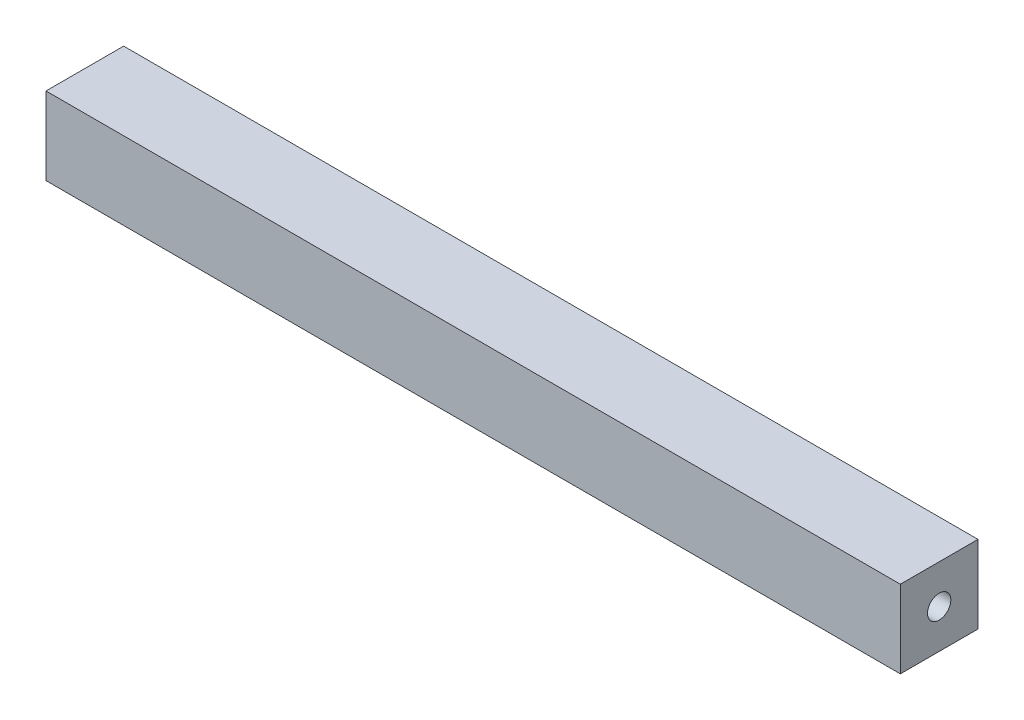
ISO-10303-21;
HEADER;
FILE_DESCRIPTION(('STEP AP214'),'2;1');
FILE_NAME('part.step','',(''),(''),'','','');
FILE_SCHEMA(('AUTOMOTIVE_DESIGN { 1 0 10303 214 1 1 1 1 }'));
ENDSEC;
DATA;
#1=APPLICATION_CONTEXT('core data for automotive mechanical design processes');
#2=APPLICATION_PROTOCOL_DEFINITION('international standard','automotive_design',2000,#1);
#3=PRODUCT_CONTEXT('',#1,'mechanical');
#4=PRODUCT('Part','Part','',(#3));
#5=PRODUCT_RELATED_PRODUCT_CATEGORY('part','',(#4));
#6=PRODUCT_DEFINITION_FORMATION('','',#4);
#7=PRODUCT_DEFINITION_CONTEXT('part definition',#1,'design');
#8=PRODUCT_DEFINITION('design','',#6,#7);
#9=PRODUCT_DEFINITION_SHAPE('','',#8);
#10=(LENGTH_UNIT() NAMED_UNIT(*) SI_UNIT(.MILLI.,.METRE.));
#11=(NAMED_UNIT(*) PLANE_ANGLE_UNIT() SI_UNIT($,.RADIAN.));
#12=(NAMED_UNIT(*) SI_UNIT($,.STERADIAN.) SOLID_ANGLE_UNIT());
#13=UNCERTAINTY_MEASURE_WITH_UNIT(LENGTH_MEASURE(1.E-05),#10,'distance_accuracy_value','');
#14=(GEOMETRIC_REPRESENTATION_CONTEXT(3) GLOBAL_UNCERTAINTY_ASSIGNED_CONTEXT((#13)) GLOBAL_UNIT_ASSIGNED_CONTEXT((#10,
#11,#12)) REPRESENTATION_CONTEXT('',''));
#15=CARTESIAN_POINT('',(0.,0.,0.));
#16=DIRECTION('',(0.,0.,1.));
#17=DIRECTION('',(1.,0.,0.));
#18=AXIS2_PLACEMENT_3D('',#15,#16,#17);
#19=CARTESIAN_POINT('',(55.,10.,5.));
#20=DIRECTION('',(-1.,0.,0.));
#21=DIRECTION('',(0.,0.,1.));
#22=AXIS2_PLACEMENT_3D('',#19,#20,#21);
#23=PLANE('',#22);
#24=CARTESIAN_POINT('',(55.,5.,0.));
#25=DIRECTION('',(1.,0.,0.));
#26=DIRECTION('',(0.,0.,-1.));
#27=AXIS2_PLACEMENT_3D('',#24,#25,#26);
#28=CIRCLE('',#27,1.5);
#29=CARTESIAN_POINT('',(55.,5.,-1.5));
#30=VERTEX_POINT('',#29);
#31=EDGE_CURVE('E112',#30,#30,#28,.T.);
#32=ORIENTED_EDGE('',*,*,#31,.F.);
#33=EDGE_LOOP('',(#32));
#34=FACE_BOUND('',#33,.T.);
#35=DIRECTION('',(0.,0.,-1.));
#36=VECTOR('',#35,1.);
#37=CARTESIAN_POINT('',(55.,0.,5.));
#38=LINE('',#37,#36);
#39=CARTESIAN_POINT('',(55.,0.,5.));
#40=VERTEX_POINT('',#39);
#41=CARTESIAN_POINT('',(55.,0.,-5.));
#42=VERTEX_POINT('',#41);
#43=EDGE_CURVE('E96',#40,#42,#38,.T.);
#44=ORIENTED_EDGE('',*,*,#43,.T.);
#45=DIRECTION('',(0.,-1.,0.));
#46=VECTOR('',#45,1.);
#47=CARTESIAN_POINT('',(55.,10.,-5.));
#48=LINE('',#47,#46);
#49=CARTESIAN_POINT('',(55.,10.,-5.));
#50=VERTEX_POINT('',#49);
#51=EDGE_CURVE('E11',#50,#42,#48,.T.);
#52=ORIENTED_EDGE('',*,*,#51,.F.);
#53=DIRECTION('',(0.,0.,-1.));
#54=VECTOR('',#53,1.);
#55=CARTESIAN_POINT('',(55.,10.,5.));
#56=LINE('',#55,#54);
#57=CARTESIAN_POINT('',(55.,10.,5.));
#58=VERTEX_POINT('',#57);
#59=EDGE_CURVE('E84',#58,#50,#56,.T.);
#60=ORIENTED_EDGE('',*,*,#59,.F.);
#61=DIRECTION('',(0.,-1.,0.));
#62=VECTOR('',#61,1.);
#63=CARTESIAN_POINT('',(55.,10.,5.));
#64=LINE('',#63,#62);
#65=EDGE_CURVE('E92',#58,#40,#64,.T.);
#66=ORIENTED_EDGE('',*,*,#65,.T.);
#67=EDGE_LOOP('',(#44,#52,#60,#66));
#68=FACE_BOUND('',#67,.T.);
#69=ADVANCED_FACE('F33',(#34,#68),#23,.F.);
#70=CARTESIAN_POINT('',(-55.,10.,-5.));
#71=DIRECTION('',(0.,0.,1.));
#72=DIRECTION('',(1.,0.,0.));
#73=AXIS2_PLACEMENT_3D('',#70,#71,#72);
#74=PLANE('',#73);
#75=DIRECTION('',(-1.,0.,0.));
#76=VECTOR('',#75,1.);
#77=CARTESIAN_POINT('',(-55.,0.,-5.));
#78=LINE('',#77,#76);
#79=CARTESIAN_POINT('',(-55.,0.,-5.));
#80=VERTEX_POINT('',#79);
#81=EDGE_CURVE('E88',#42,#80,#78,.T.);
#82=ORIENTED_EDGE('',*,*,#81,.T.);
#83=DIRECTION('',(0.,-1.,0.));
#84=VECTOR('',#83,1.);
#85=CARTESIAN_POINT('',(-55.,10.,-5.));
#86=LINE('',#85,#84);
#87=CARTESIAN_POINT('',(-55.,10.,-5.));
#88=VERTEX_POINT('',#87);
#89=EDGE_CURVE('E41',#88,#80,#86,.T.);
#90=ORIENTED_EDGE('',*,*,#89,.F.);
#91=DIRECTION('',(-1.,0.,0.));
#92=VECTOR('',#91,1.);
#93=CARTESIAN_POINT('',(-55.,10.,-5.));
#94=LINE('',#93,#92);
#95=EDGE_CURVE('E79',#50,#88,#94,.T.);
#96=ORIENTED_EDGE('',*,*,#95,.F.);
#97=ORIENTED_EDGE('',*,*,#51,.T.);
#98=EDGE_LOOP('',(#82,#90,#96,#97));
#99=FACE_BOUND('',#98,.T.);
#100=ADVANCED_FACE('F87',(#99),#74,.F.);
#101=CARTESIAN_POINT('',(-55.,10.,5.));
#102=DIRECTION('',(1.,0.,0.));
#103=DIRECTION('',(0.,0.,-1.));
#104=AXIS2_PLACEMENT_3D('',#101,#102,#103);
#105=PLANE('',#104);
#106=CARTESIAN_POINT('',(-55.,5.,0.));
#107=DIRECTION('',(1.,0.,0.));
#108=DIRECTION('',(0.,0.,-1.));
#109=AXIS2_PLACEMENT_3D('',#106,#107,#108);
#110=CIRCLE('',#109,1.5);
#111=CARTESIAN_POINT('',(-55.,5.,-1.5));
#112=VERTEX_POINT('',#111);
#113=EDGE_CURVE('E99',#112,#112,#110,.T.);
#114=ORIENTED_EDGE('',*,*,#113,.T.);
#115=EDGE_LOOP('',(#114));
#116=FACE_BOUND('',#115,.T.);
#117=DIRECTION('',(0.,0.,1.));
#118=VECTOR('',#117,1.);
#119=CARTESIAN_POINT('',(-55.,0.,5.));
#120=LINE('',#119,#118);
#121=CARTESIAN_POINT('',(-55.,0.,5.));
#122=VERTEX_POINT('',#121);
#123=EDGE_CURVE('E66',#80,#122,#120,.T.);
#124=ORIENTED_EDGE('',*,*,#123,.T.);
#125=DIRECTION('',(0.,-1.,0.));
#126=VECTOR('',#125,1.);
#127=CARTESIAN_POINT('',(-55.,10.,5.));
#128=LINE('',#127,#126);
#129=CARTESIAN_POINT('',(-55.,10.,5.));
#130=VERTEX_POINT('',#129);
#131=EDGE_CURVE('E89',#130,#122,#128,.T.);
#132=ORIENTED_EDGE('',*,*,#131,.F.);
#133=DIRECTION('',(0.,0.,1.));
#134=VECTOR('',#133,1.);
#135=CARTESIAN_POINT('',(-55.,10.,5.));
#136=LINE('',#135,#134);
#137=EDGE_CURVE('E82',#88,#130,#136,.T.);
#138=ORIENTED_EDGE('',*,*,#137,.F.);
#139=ORIENTED_EDGE('',*,*,#89,.T.);
#140=EDGE_LOOP('',(#124,#132,#138,#139));
#141=FACE_BOUND('',#140,.T.);
#142=ADVANCED_FACE('F90',(#116,#141),#105,.F.);
#143=CARTESIAN_POINT('',(-55.,10.,5.));
#144=DIRECTION('',(0.,0.,-1.));
#145=DIRECTION('',(-1.,0.,0.));
#146=AXIS2_PLACEMENT_3D('',#143,#144,#145);
#147=PLANE('',#146);
#148=DIRECTION('',(1.,0.,0.));
#149=VECTOR('',#148,1.);
#150=CARTESIAN_POINT('',(-55.,0.,5.));
#151=LINE('',#150,#149);
#152=EDGE_CURVE('E72',#122,#40,#151,.T.);
#153=ORIENTED_EDGE('',*,*,#152,.T.);
#154=ORIENTED_EDGE('',*,*,#65,.F.);
#155=DIRECTION('',(1.,0.,0.));
#156=VECTOR('',#155,1.);
#157=CARTESIAN_POINT('',(-55.,10.,5.));
#158=LINE('',#157,#156);
#159=EDGE_CURVE('E49',#130,#58,#158,.T.);
#160=ORIENTED_EDGE('',*,*,#159,.F.);
#161=ORIENTED_EDGE('',*,*,#131,.T.);
#162=EDGE_LOOP('',(#153,#154,#160,#161));
#163=FACE_BOUND('',#162,.T.);
#164=ADVANCED_FACE('F104',(#163),#147,.F.);
#165=CARTESIAN_POINT('',(0.,10.,0.));
#166=DIRECTION('',(0.,-1.,0.));
#167=DIRECTION('',(0.,0.,-1.));
#168=AXIS2_PLACEMENT_3D('',#165,#166,#167);
#169=PLANE('',#168);
#170=ORIENTED_EDGE('',*,*,#59,.T.);
#171=ORIENTED_EDGE('',*,*,#95,.T.);
#172=ORIENTED_EDGE('',*,*,#137,.T.);
#173=ORIENTED_EDGE('',*,*,#159,.T.);
#174=EDGE_LOOP('',(#170,#171,#172,#173));
#175=FACE_BOUND('',#174,.T.);
#176=ADVANCED_FACE('F80',(#175),#169,.F.);
#177=CARTESIAN_POINT('',(0.,0.,0.));
#178=DIRECTION('',(0.,-1.,0.));
#179=DIRECTION('',(0.,0.,-1.));
#180=AXIS2_PLACEMENT_3D('',#177,#178,#179);
#181=PLANE('',#180);
#182=ORIENTED_EDGE('',*,*,#43,.F.);
#183=ORIENTED_EDGE('',*,*,#152,.F.);
#184=ORIENTED_EDGE('',*,*,#123,.F.);
#185=ORIENTED_EDGE('',*,*,#81,.F.);
#186=EDGE_LOOP('',(#182,#183,#184,#185));
#187=FACE_BOUND('',#186,.T.);
#188=ADVANCED_FACE('F107',(#187),#181,.T.);
#189=CARTESIAN_POINT('',(-55.,5.,0.));
#190=DIRECTION('',(1.,0.,0.));
#191=DIRECTION('',(0.,0.,-1.));
#192=AXIS2_PLACEMENT_3D('',#189,#190,#191);
#193=CYLINDRICAL_SURFACE('',#192,1.5);
#194=ORIENTED_EDGE('',*,*,#113,.F.);
#195=EDGE_LOOP('',(#194));
#196=FACE_BOUND('',#195,.T.);
#197=ORIENTED_EDGE('',*,*,#31,.T.);
#198=EDGE_LOOP('',(#197));
#199=FACE_BOUND('',#198,.T.);
#200=ADVANCED_FACE('F116',(#196,#199),#193,.F.);
#201=CLOSED_SHELL('',(#69,#100,#142,#164,#176,#188,#200));
#202=MANIFOLD_SOLID_BREP('B2',#201);
#203=ADVANCED_BREP_SHAPE_REPRESENTATION('',(#18,#202),#14);
#204=SHAPE_DEFINITION_REPRESENTATION(#9,#203);
ENDSEC;
END-ISO-10303-21;
